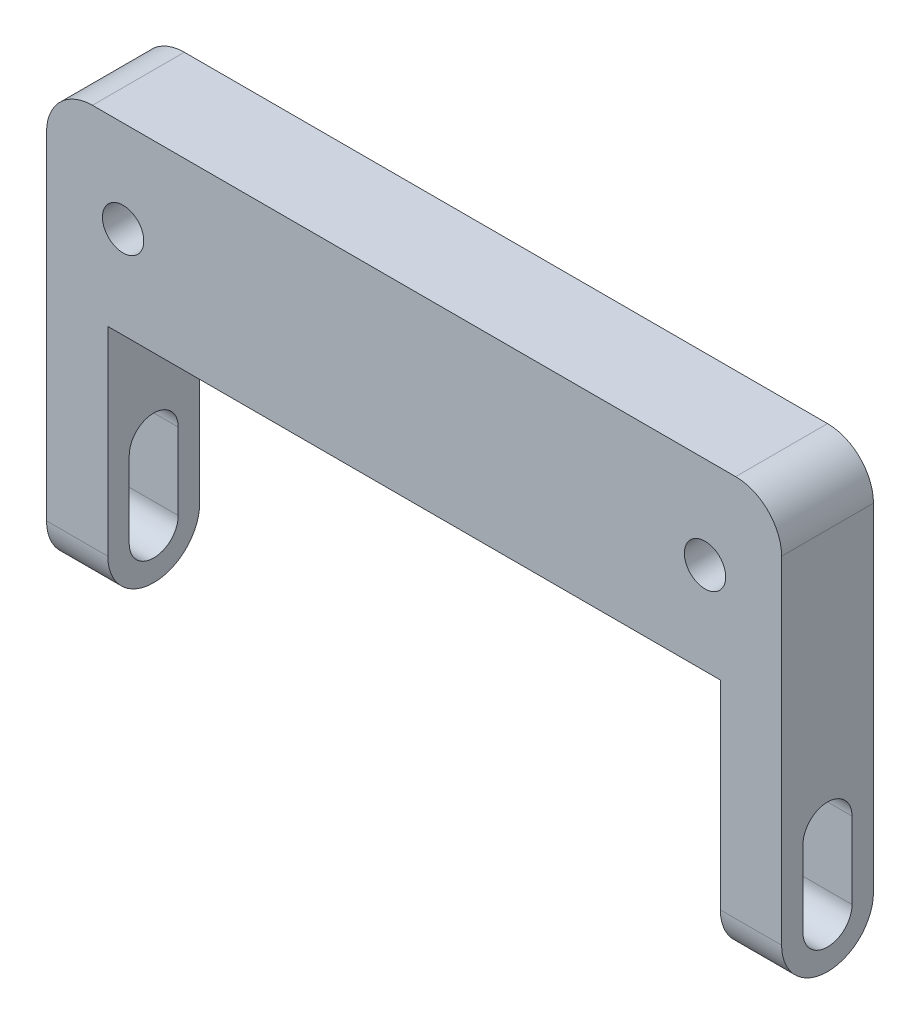
ISO-10303-21;
HEADER;
FILE_DESCRIPTION(('STEP AP214'),'2;1');
FILE_NAME('part.step','',(''),(''),'','','');
FILE_SCHEMA(('AUTOMOTIVE_DESIGN { 1 0 10303 214 1 1 1 1 }'));
ENDSEC;
DATA;
#1=APPLICATION_CONTEXT('core data for automotive mechanical design processes');
#2=APPLICATION_PROTOCOL_DEFINITION('international standard','automotive_design',2000,#1);
#3=PRODUCT_CONTEXT('',#1,'mechanical');
#4=PRODUCT('Part','Part','',(#3));
#5=PRODUCT_RELATED_PRODUCT_CATEGORY('part','',(#4));
#6=PRODUCT_DEFINITION_FORMATION('','',#4);
#7=PRODUCT_DEFINITION_CONTEXT('part definition',#1,'design');
#8=PRODUCT_DEFINITION('design','',#6,#7);
#9=PRODUCT_DEFINITION_SHAPE('','',#8);
#10=(LENGTH_UNIT() NAMED_UNIT(*) SI_UNIT(.MILLI.,.METRE.));
#11=(NAMED_UNIT(*) PLANE_ANGLE_UNIT() SI_UNIT($,.RADIAN.));
#12=(NAMED_UNIT(*) SI_UNIT($,.STERADIAN.) SOLID_ANGLE_UNIT());
#13=UNCERTAINTY_MEASURE_WITH_UNIT(LENGTH_MEASURE(1.E-05),#10,'distance_accuracy_value','');
#14=(GEOMETRIC_REPRESENTATION_CONTEXT(3) GLOBAL_UNCERTAINTY_ASSIGNED_CONTEXT((#13)) GLOBAL_UNIT_ASSIGNED_CONTEXT((#10,
#11,#12)) REPRESENTATION_CONTEXT('',''));
#15=CARTESIAN_POINT('',(0.,0.,0.));
#16=DIRECTION('',(0.,0.,1.));
#17=DIRECTION('',(1.,0.,0.));
#18=AXIS2_PLACEMENT_3D('',#15,#16,#17);
#19=CARTESIAN_POINT('',(-24.,-6.,6.));
#20=DIRECTION('',(1.,0.,0.));
#21=DIRECTION('',(0.,1.,0.));
#22=AXIS2_PLACEMENT_3D('',#19,#20,#21);
#23=PLANE('',#22);
#24=DIRECTION('',(0.,-1.,0.));
#25=VECTOR('',#24,1.);
#26=CARTESIAN_POINT('',(-24.,-6.,6.));
#27=LINE('',#26,#25);
#28=CARTESIAN_POINT('',(-24.,3.,6.));
#29=VERTEX_POINT('',#28);
#30=CARTESIAN_POINT('',(-24.,-19.,6.));
#31=VERTEX_POINT('',#30);
#32=EDGE_CURVE('E251',#29,#31,#27,.T.);
#33=ORIENTED_EDGE('',*,*,#32,.F.);
#34=DIRECTION('',(0.,0.,-1.));
#35=VECTOR('',#34,1.);
#36=CARTESIAN_POINT('',(-24.,3.,6.));
#37=LINE('',#36,#35);
#38=CARTESIAN_POINT('',(-24.,3.,0.));
#39=VERTEX_POINT('',#38);
#40=EDGE_CURVE('E284',#29,#39,#37,.T.);
#41=ORIENTED_EDGE('',*,*,#40,.T.);
#42=DIRECTION('',(0.,-1.,0.));
#43=VECTOR('',#42,1.);
#44=CARTESIAN_POINT('',(-24.,-6.,0.));
#45=LINE('',#44,#43);
#46=CARTESIAN_POINT('',(-24.,-19.,0.));
#47=VERTEX_POINT('',#46);
#48=EDGE_CURVE('E264',#39,#47,#45,.T.);
#49=ORIENTED_EDGE('',*,*,#48,.T.);
#50=CARTESIAN_POINT('',(-24.,-19.,3.));
#51=DIRECTION('',(1.,0.,0.));
#52=DIRECTION('',(0.,1.,0.));
#53=AXIS2_PLACEMENT_3D('',#50,#51,#52);
#54=CIRCLE('',#53,3.);
#55=CARTESIAN_POINT('',(-24.,-22.,3.));
#56=VERTEX_POINT('',#55);
#57=EDGE_CURVE('E280',#47,#56,#54,.F.);
#58=ORIENTED_EDGE('',*,*,#57,.T.);
#59=CARTESIAN_POINT('',(-24.,-19.,3.));
#60=DIRECTION('',(1.,0.,0.));
#61=DIRECTION('',(0.,1.,0.));
#62=AXIS2_PLACEMENT_3D('',#59,#60,#61);
#63=CIRCLE('',#62,3.);
#64=EDGE_CURVE('E282',#56,#31,#63,.F.);
#65=ORIENTED_EDGE('',*,*,#64,.T.);
#66=EDGE_LOOP('',(#33,#41,#49,#58,#65));
#67=FACE_BOUND('',#66,.T.);
#68=CARTESIAN_POINT('',(-24.,-14.,3.));
#69=DIRECTION('',(1.,0.,0.));
#70=DIRECTION('',(0.,1.,0.));
#71=AXIS2_PLACEMENT_3D('',#68,#69,#70);
#72=CIRCLE('',#71,1.6);
#73=CARTESIAN_POINT('',(-24.,-14.,1.4));
#74=VERTEX_POINT('',#73);
#75=CARTESIAN_POINT('',(-24.,-14.,4.6));
#76=VERTEX_POINT('',#75);
#77=EDGE_CURVE('E190',#74,#76,#72,.T.);
#78=ORIENTED_EDGE('',*,*,#77,.T.);
#79=DIRECTION('',(0.,-1.,0.));
#80=VECTOR('',#79,1.);
#81=CARTESIAN_POINT('',(-24.,-14.,4.6));
#82=LINE('',#81,#80);
#83=CARTESIAN_POINT('',(-24.,-19.,4.6));
#84=VERTEX_POINT('',#83);
#85=EDGE_CURVE('E191',#76,#84,#82,.T.);
#86=ORIENTED_EDGE('',*,*,#85,.T.);
#87=CARTESIAN_POINT('',(-24.,-19.,3.));
#88=DIRECTION('',(1.,0.,0.));
#89=DIRECTION('',(0.,1.,0.));
#90=AXIS2_PLACEMENT_3D('',#87,#88,#89);
#91=CIRCLE('',#90,1.6);
#92=CARTESIAN_POINT('',(-24.,-19.,1.4));
#93=VERTEX_POINT('',#92);
#94=EDGE_CURVE('E204',#84,#93,#91,.T.);
#95=ORIENTED_EDGE('',*,*,#94,.T.);
#96=DIRECTION('',(0.,1.,0.));
#97=VECTOR('',#96,1.);
#98=CARTESIAN_POINT('',(-24.,-14.,1.4));
#99=LINE('',#98,#97);
#100=EDGE_CURVE('E197',#93,#74,#99,.T.);
#101=ORIENTED_EDGE('',*,*,#100,.T.);
#102=EDGE_LOOP('',(#78,#86,#95,#101));
#103=FACE_BOUND('',#102,.T.);
#104=ADVANCED_FACE('F34',(#67,#103),#23,.F.);
#105=CARTESIAN_POINT('',(-20.,-6.,6.));
#106=DIRECTION('',(-1.,0.,0.));
#107=DIRECTION('',(0.,-1.,0.));
#108=AXIS2_PLACEMENT_3D('',#105,#106,#107);
#109=PLANE('',#108);
#110=DIRECTION('',(0.,1.,0.));
#111=VECTOR('',#110,1.);
#112=CARTESIAN_POINT('',(-20.,-6.,6.));
#113=LINE('',#112,#111);
#114=CARTESIAN_POINT('',(-20.,-19.,6.));
#115=VERTEX_POINT('',#114);
#116=CARTESIAN_POINT('',(-20.,-6.,6.));
#117=VERTEX_POINT('',#116);
#118=EDGE_CURVE('E254',#115,#117,#113,.T.);
#119=ORIENTED_EDGE('',*,*,#118,.F.);
#120=CARTESIAN_POINT('',(-20.,-19.,3.));
#121=DIRECTION('',(-1.,0.,0.));
#122=DIRECTION('',(0.,-1.,0.));
#123=AXIS2_PLACEMENT_3D('',#120,#121,#122);
#124=CIRCLE('',#123,3.);
#125=CARTESIAN_POINT('',(-20.,-22.,3.));
#126=VERTEX_POINT('',#125);
#127=EDGE_CURVE('E57',#115,#126,#124,.F.);
#128=ORIENTED_EDGE('',*,*,#127,.T.);
#129=CARTESIAN_POINT('',(-20.,-19.,3.));
#130=DIRECTION('',(-1.,0.,0.));
#131=DIRECTION('',(0.,-1.,0.));
#132=AXIS2_PLACEMENT_3D('',#129,#130,#131);
#133=CIRCLE('',#132,3.);
#134=CARTESIAN_POINT('',(-20.,-19.,0.));
#135=VERTEX_POINT('',#134);
#136=EDGE_CURVE('E316',#126,#135,#133,.F.);
#137=ORIENTED_EDGE('',*,*,#136,.T.);
#138=DIRECTION('',(0.,1.,0.));
#139=VECTOR('',#138,1.);
#140=CARTESIAN_POINT('',(-20.,-6.,0.));
#141=LINE('',#140,#139);
#142=CARTESIAN_POINT('',(-20.,-6.,0.));
#143=VERTEX_POINT('',#142);
#144=EDGE_CURVE('E267',#135,#143,#141,.T.);
#145=ORIENTED_EDGE('',*,*,#144,.T.);
#146=DIRECTION('',(0.,0.,-1.));
#147=VECTOR('',#146,1.);
#148=CARTESIAN_POINT('',(-20.,-6.,6.));
#149=LINE('',#148,#147);
#150=EDGE_CURVE('E277',#117,#143,#149,.T.);
#151=ORIENTED_EDGE('',*,*,#150,.F.);
#152=EDGE_LOOP('',(#119,#128,#137,#145,#151));
#153=FACE_BOUND('',#152,.T.);
#154=CARTESIAN_POINT('',(-20.,-14.,3.));
#155=DIRECTION('',(-1.,0.,0.));
#156=DIRECTION('',(0.,-1.,0.));
#157=AXIS2_PLACEMENT_3D('',#154,#155,#156);
#158=CIRCLE('',#157,1.6);
#159=CARTESIAN_POINT('',(-20.,-14.,4.6));
#160=VERTEX_POINT('',#159);
#161=CARTESIAN_POINT('',(-20.,-14.,1.4));
#162=VERTEX_POINT('',#161);
#163=EDGE_CURVE('E187',#160,#162,#158,.T.);
#164=ORIENTED_EDGE('',*,*,#163,.T.);
#165=DIRECTION('',(0.,-1.,0.));
#166=VECTOR('',#165,1.);
#167=CARTESIAN_POINT('',(-20.,-14.,1.4));
#168=LINE('',#167,#166);
#169=CARTESIAN_POINT('',(-20.,-19.,1.4));
#170=VERTEX_POINT('',#169);
#171=EDGE_CURVE('E171',#162,#170,#168,.T.);
#172=ORIENTED_EDGE('',*,*,#171,.T.);
#173=CARTESIAN_POINT('',(-20.,-19.,3.));
#174=DIRECTION('',(-1.,0.,0.));
#175=DIRECTION('',(0.,-1.,0.));
#176=AXIS2_PLACEMENT_3D('',#173,#174,#175);
#177=CIRCLE('',#176,1.6);
#178=CARTESIAN_POINT('',(-20.,-19.,4.6));
#179=VERTEX_POINT('',#178);
#180=EDGE_CURVE('E199',#170,#179,#177,.T.);
#181=ORIENTED_EDGE('',*,*,#180,.T.);
#182=DIRECTION('',(0.,1.,0.));
#183=VECTOR('',#182,1.);
#184=CARTESIAN_POINT('',(-20.,-14.,4.6));
#185=LINE('',#184,#183);
#186=EDGE_CURVE('E195',#179,#160,#185,.T.);
#187=ORIENTED_EDGE('',*,*,#186,.T.);
#188=EDGE_LOOP('',(#164,#172,#181,#187));
#189=FACE_BOUND('',#188,.T.);
#190=ADVANCED_FACE('F194',(#153,#189),#109,.F.);
#191=CARTESIAN_POINT('',(-24.,6.,6.));
#192=DIRECTION('',(0.,-1.,0.));
#193=DIRECTION('',(0.,0.,-1.));
#194=AXIS2_PLACEMENT_3D('',#191,#192,#193);
#195=PLANE('',#194);
#196=DIRECTION('',(-1.,0.,0.));
#197=VECTOR('',#196,1.);
#198=CARTESIAN_POINT('',(-24.,6.,0.));
#199=LINE('',#198,#197);
#200=CARTESIAN_POINT('',(21.,6.,0.));
#201=VERTEX_POINT('',#200);
#202=CARTESIAN_POINT('',(-21.,6.,0.));
#203=VERTEX_POINT('',#202);
#204=EDGE_CURVE('E243',#201,#203,#199,.T.);
#205=ORIENTED_EDGE('',*,*,#204,.T.);
#206=DIRECTION('',(0.,0.,-1.));
#207=VECTOR('',#206,1.);
#208=CARTESIAN_POINT('',(-21.,6.,6.));
#209=LINE('',#208,#207);
#210=CARTESIAN_POINT('',(-21.,6.,6.));
#211=VERTEX_POINT('',#210);
#212=EDGE_CURVE('E299',#203,#211,#209,.F.);
#213=ORIENTED_EDGE('',*,*,#212,.T.);
#214=DIRECTION('',(-1.,0.,0.));
#215=VECTOR('',#214,1.);
#216=CARTESIAN_POINT('',(-24.,6.,6.));
#217=LINE('',#216,#215);
#218=CARTESIAN_POINT('',(21.,6.,6.));
#219=VERTEX_POINT('',#218);
#220=EDGE_CURVE('E247',#219,#211,#217,.T.);
#221=ORIENTED_EDGE('',*,*,#220,.F.);
#222=DIRECTION('',(0.,0.,-1.));
#223=VECTOR('',#222,1.);
#224=CARTESIAN_POINT('',(21.,6.,6.));
#225=LINE('',#224,#223);
#226=EDGE_CURVE('E296',#219,#201,#225,.T.);
#227=ORIENTED_EDGE('',*,*,#226,.T.);
#228=EDGE_LOOP('',(#205,#213,#221,#227));
#229=FACE_BOUND('',#228,.T.);
#230=ADVANCED_FACE('F380',(#229),#195,.F.);
#231=CARTESIAN_POINT('',(-20.,-6.,6.));
#232=DIRECTION('',(0.,1.,0.));
#233=DIRECTION('',(0.,0.,1.));
#234=AXIS2_PLACEMENT_3D('',#231,#232,#233);
#235=PLANE('',#234);
#236=DIRECTION('',(1.,0.,0.));
#237=VECTOR('',#236,1.);
#238=CARTESIAN_POINT('',(-20.,-6.,0.));
#239=LINE('',#238,#237);
#240=CARTESIAN_POINT('',(20.,-6.,0.));
#241=VERTEX_POINT('',#240);
#242=EDGE_CURVE('E269',#143,#241,#239,.T.);
#243=ORIENTED_EDGE('',*,*,#242,.T.);
#244=DIRECTION('',(0.,0.,-1.));
#245=VECTOR('',#244,1.);
#246=CARTESIAN_POINT('',(20.,-6.,6.));
#247=LINE('',#246,#245);
#248=CARTESIAN_POINT('',(20.,-6.,6.));
#249=VERTEX_POINT('',#248);
#250=EDGE_CURVE('E261',#249,#241,#247,.T.);
#251=ORIENTED_EDGE('',*,*,#250,.F.);
#252=DIRECTION('',(1.,0.,0.));
#253=VECTOR('',#252,1.);
#254=CARTESIAN_POINT('',(-20.,-6.,6.));
#255=LINE('',#254,#253);
#256=EDGE_CURVE('E256',#117,#249,#255,.T.);
#257=ORIENTED_EDGE('',*,*,#256,.F.);
#258=ORIENTED_EDGE('',*,*,#150,.T.);
#259=EDGE_LOOP('',(#243,#251,#257,#258));
#260=FACE_BOUND('',#259,.T.);
#261=ADVANCED_FACE('F402',(#260),#235,.F.);
#262=CARTESIAN_POINT('',(20.,-6.,6.));
#263=DIRECTION('',(1.,0.,0.));
#264=DIRECTION('',(0.,1.,0.));
#265=AXIS2_PLACEMENT_3D('',#262,#263,#264);
#266=PLANE('',#265);
#267=CARTESIAN_POINT('',(20.,-14.,3.));
#268=DIRECTION('',(1.,0.,0.));
#269=DIRECTION('',(0.,1.,0.));
#270=AXIS2_PLACEMENT_3D('',#267,#268,#269);
#271=CIRCLE('',#270,1.6);
#272=CARTESIAN_POINT('',(20.,-14.,4.6));
#273=VERTEX_POINT('',#272);
#274=CARTESIAN_POINT('',(20.,-14.,1.4));
#275=VERTEX_POINT('',#274);
#276=EDGE_CURVE('E214',#273,#275,#271,.F.);
#277=ORIENTED_EDGE('',*,*,#276,.F.);
#278=DIRECTION('',(0.,1.,0.));
#279=VECTOR('',#278,1.);
#280=CARTESIAN_POINT('',(20.,-14.,4.6));
#281=LINE('',#280,#279);
#282=CARTESIAN_POINT('',(20.,-19.,4.6));
#283=VERTEX_POINT('',#282);
#284=EDGE_CURVE('E182',#283,#273,#281,.T.);
#285=ORIENTED_EDGE('',*,*,#284,.F.);
#286=CARTESIAN_POINT('',(20.,-19.,3.));
#287=DIRECTION('',(1.,0.,0.));
#288=DIRECTION('',(0.,1.,0.));
#289=AXIS2_PLACEMENT_3D('',#286,#287,#288);
#290=CIRCLE('',#289,1.6);
#291=CARTESIAN_POINT('',(20.,-19.,1.4));
#292=VERTEX_POINT('',#291);
#293=EDGE_CURVE('E227',#292,#283,#290,.F.);
#294=ORIENTED_EDGE('',*,*,#293,.F.);
#295=DIRECTION('',(0.,-1.,0.));
#296=VECTOR('',#295,1.);
#297=CARTESIAN_POINT('',(20.,-14.,1.4));
#298=LINE('',#297,#296);
#299=EDGE_CURVE('E230',#275,#292,#298,.T.);
#300=ORIENTED_EDGE('',*,*,#299,.F.);
#301=EDGE_LOOP('',(#277,#285,#294,#300));
#302=FACE_BOUND('',#301,.T.);
#303=DIRECTION('',(0.,-1.,0.));
#304=VECTOR('',#303,1.);
#305=CARTESIAN_POINT('',(20.,-6.,0.));
#306=LINE('',#305,#304);
#307=CARTESIAN_POINT('',(20.,-19.,0.));
#308=VERTEX_POINT('',#307);
#309=EDGE_CURVE('E271',#241,#308,#306,.T.);
#310=ORIENTED_EDGE('',*,*,#309,.T.);
#311=CARTESIAN_POINT('',(20.,-19.,3.));
#312=DIRECTION('',(1.,0.,0.));
#313=DIRECTION('',(0.,1.,0.));
#314=AXIS2_PLACEMENT_3D('',#311,#312,#313);
#315=CIRCLE('',#314,3.);
#316=CARTESIAN_POINT('',(20.,-22.,3.));
#317=VERTEX_POINT('',#316);
#318=EDGE_CURVE('E11',#308,#317,#315,.F.);
#319=ORIENTED_EDGE('',*,*,#318,.T.);
#320=CARTESIAN_POINT('',(20.,-19.,3.));
#321=DIRECTION('',(1.,0.,0.));
#322=DIRECTION('',(0.,1.,0.));
#323=AXIS2_PLACEMENT_3D('',#320,#321,#322);
#324=CIRCLE('',#323,3.);
#325=CARTESIAN_POINT('',(20.,-19.,6.));
#326=VERTEX_POINT('',#325);
#327=EDGE_CURVE('E43',#317,#326,#324,.F.);
#328=ORIENTED_EDGE('',*,*,#327,.T.);
#329=DIRECTION('',(0.,-1.,0.));
#330=VECTOR('',#329,1.);
#331=CARTESIAN_POINT('',(20.,-6.,6.));
#332=LINE('',#331,#330);
#333=EDGE_CURVE('E258',#249,#326,#332,.T.);
#334=ORIENTED_EDGE('',*,*,#333,.F.);
#335=ORIENTED_EDGE('',*,*,#250,.T.);
#336=EDGE_LOOP('',(#310,#319,#328,#334,#335));
#337=FACE_BOUND('',#336,.T.);
#338=ADVANCED_FACE('F397',(#302,#337),#266,.F.);
#339=CARTESIAN_POINT('',(24.,-6.,6.));
#340=DIRECTION('',(-1.,0.,0.));
#341=DIRECTION('',(0.,-1.,0.));
#342=AXIS2_PLACEMENT_3D('',#339,#340,#341);
#343=PLANE('',#342);
#344=CARTESIAN_POINT('',(24.,-19.,3.));
#345=DIRECTION('',(1.,0.,0.));
#346=DIRECTION('',(0.,1.,0.));
#347=AXIS2_PLACEMENT_3D('',#344,#345,#346);
#348=CIRCLE('',#347,1.6);
#349=CARTESIAN_POINT('',(24.,-19.,4.6));
#350=VERTEX_POINT('',#349);
#351=CARTESIAN_POINT('',(24.,-19.,1.4));
#352=VERTEX_POINT('',#351);
#353=EDGE_CURVE('E218',#350,#352,#348,.T.);
#354=ORIENTED_EDGE('',*,*,#353,.F.);
#355=DIRECTION('',(0.,-1.,0.));
#356=VECTOR('',#355,1.);
#357=CARTESIAN_POINT('',(24.,-14.,4.6));
#358=LINE('',#357,#356);
#359=CARTESIAN_POINT('',(24.,-14.,4.6));
#360=VERTEX_POINT('',#359);
#361=EDGE_CURVE('E221',#360,#350,#358,.T.);
#362=ORIENTED_EDGE('',*,*,#361,.F.);
#363=CARTESIAN_POINT('',(24.,-14.,3.));
#364=DIRECTION('',(1.,0.,0.));
#365=DIRECTION('',(0.,1.,0.));
#366=AXIS2_PLACEMENT_3D('',#363,#364,#365);
#367=CIRCLE('',#366,1.6);
#368=CARTESIAN_POINT('',(24.,-14.,1.4));
#369=VERTEX_POINT('',#368);
#370=EDGE_CURVE('E224',#369,#360,#367,.T.);
#371=ORIENTED_EDGE('',*,*,#370,.F.);
#372=DIRECTION('',(0.,1.,0.));
#373=VECTOR('',#372,1.);
#374=CARTESIAN_POINT('',(24.,-14.,1.4));
#375=LINE('',#374,#373);
#376=EDGE_CURVE('E215',#352,#369,#375,.T.);
#377=ORIENTED_EDGE('',*,*,#376,.F.);
#378=EDGE_LOOP('',(#354,#362,#371,#377));
#379=FACE_BOUND('',#378,.T.);
#380=DIRECTION('',(0.,1.,0.));
#381=VECTOR('',#380,1.);
#382=CARTESIAN_POINT('',(24.,-6.,0.));
#383=LINE('',#382,#381);
#384=CARTESIAN_POINT('',(24.,-19.,0.));
#385=VERTEX_POINT('',#384);
#386=CARTESIAN_POINT('',(24.,3.,0.));
#387=VERTEX_POINT('',#386);
#388=EDGE_CURVE('E248',#385,#387,#383,.T.);
#389=ORIENTED_EDGE('',*,*,#388,.T.);
#390=DIRECTION('',(0.,0.,-1.));
#391=VECTOR('',#390,1.);
#392=CARTESIAN_POINT('',(24.,3.,6.));
#393=LINE('',#392,#391);
#394=CARTESIAN_POINT('',(24.,3.,6.));
#395=VERTEX_POINT('',#394);
#396=EDGE_CURVE('E314',#387,#395,#393,.F.);
#397=ORIENTED_EDGE('',*,*,#396,.T.);
#398=DIRECTION('',(0.,1.,0.));
#399=VECTOR('',#398,1.);
#400=CARTESIAN_POINT('',(24.,-6.,6.));
#401=LINE('',#400,#399);
#402=CARTESIAN_POINT('',(24.,-19.,6.));
#403=VERTEX_POINT('',#402);
#404=EDGE_CURVE('E244',#403,#395,#401,.T.);
#405=ORIENTED_EDGE('',*,*,#404,.F.);
#406=CARTESIAN_POINT('',(24.,-19.,3.));
#407=DIRECTION('',(-1.,0.,0.));
#408=DIRECTION('',(0.,-1.,0.));
#409=AXIS2_PLACEMENT_3D('',#406,#407,#408);
#410=CIRCLE('',#409,3.);
#411=CARTESIAN_POINT('',(24.,-22.,3.));
#412=VERTEX_POINT('',#411);
#413=EDGE_CURVE('E310',#403,#412,#410,.F.);
#414=ORIENTED_EDGE('',*,*,#413,.T.);
#415=CARTESIAN_POINT('',(24.,-19.,3.));
#416=DIRECTION('',(-1.,0.,0.));
#417=DIRECTION('',(0.,-1.,0.));
#418=AXIS2_PLACEMENT_3D('',#415,#416,#417);
#419=CIRCLE('',#418,3.);
#420=EDGE_CURVE('E312',#412,#385,#419,.F.);
#421=ORIENTED_EDGE('',*,*,#420,.T.);
#422=EDGE_LOOP('',(#389,#397,#405,#414,#421));
#423=FACE_BOUND('',#422,.T.);
#424=ADVANCED_FACE('F387',(#379,#423),#343,.F.);
#425=CARTESIAN_POINT('',(0.,0.,6.));
#426=DIRECTION('',(0.,0.,-1.));
#427=DIRECTION('',(-1.,0.,0.));
#428=AXIS2_PLACEMENT_3D('',#425,#426,#427);
#429=PLANE('',#428);
#430=CARTESIAN_POINT('',(19.,0.,6.));
#431=DIRECTION('',(0.,0.,-1.));
#432=DIRECTION('',(-1.,0.,0.));
#433=AXIS2_PLACEMENT_3D('',#430,#431,#432);
#434=CIRCLE('',#433,1.35);
#435=CARTESIAN_POINT('',(17.65,0.,6.));
#436=VERTEX_POINT('',#435);
#437=EDGE_CURVE('E335',#436,#436,#434,.T.);
#438=ORIENTED_EDGE('',*,*,#437,.T.);
#439=EDGE_LOOP('',(#438));
#440=FACE_BOUND('',#439,.T.);
#441=CARTESIAN_POINT('',(-19.,0.,6.));
#442=DIRECTION('',(0.,0.,-1.));
#443=DIRECTION('',(-1.,0.,0.));
#444=AXIS2_PLACEMENT_3D('',#441,#442,#443);
#445=CIRCLE('',#444,1.35);
#446=CARTESIAN_POINT('',(-20.35,0.,6.));
#447=VERTEX_POINT('',#446);
#448=EDGE_CURVE('E325',#447,#447,#445,.T.);
#449=ORIENTED_EDGE('',*,*,#448,.T.);
#450=EDGE_LOOP('',(#449));
#451=FACE_BOUND('',#450,.T.);
#452=ORIENTED_EDGE('',*,*,#220,.T.);
#453=CARTESIAN_POINT('',(-21.,3.,6.));
#454=DIRECTION('',(0.,0.,-1.));
#455=DIRECTION('',(-1.,0.,0.));
#456=AXIS2_PLACEMENT_3D('',#453,#454,#455);
#457=CIRCLE('',#456,3.);
#458=EDGE_CURVE('E308',#211,#29,#457,.F.);
#459=ORIENTED_EDGE('',*,*,#458,.T.);
#460=ORIENTED_EDGE('',*,*,#32,.T.);
#461=DIRECTION('',(1.,0.,0.));
#462=VECTOR('',#461,1.);
#463=CARTESIAN_POINT('',(0.,-19.,6.));
#464=LINE('',#463,#462);
#465=EDGE_CURVE('E303',#31,#115,#464,.T.);
#466=ORIENTED_EDGE('',*,*,#465,.T.);
#467=ORIENTED_EDGE('',*,*,#118,.T.);
#468=ORIENTED_EDGE('',*,*,#256,.T.);
#469=ORIENTED_EDGE('',*,*,#333,.T.);
#470=DIRECTION('',(1.,0.,0.));
#471=VECTOR('',#470,1.);
#472=CARTESIAN_POINT('',(0.,-19.,6.));
#473=LINE('',#472,#471);
#474=EDGE_CURVE('E301',#326,#403,#473,.T.);
#475=ORIENTED_EDGE('',*,*,#474,.T.);
#476=ORIENTED_EDGE('',*,*,#404,.T.);
#477=CARTESIAN_POINT('',(21.,3.,6.));
#478=DIRECTION('',(0.,0.,-1.));
#479=DIRECTION('',(-1.,0.,0.));
#480=AXIS2_PLACEMENT_3D('',#477,#478,#479);
#481=CIRCLE('',#480,3.);
#482=EDGE_CURVE('E306',#395,#219,#481,.F.);
#483=ORIENTED_EDGE('',*,*,#482,.T.);
#484=EDGE_LOOP('',(#452,#459,#460,#466,#467,#468,#469,#475,#476,#483));
#485=FACE_BOUND('',#484,.T.);
#486=ADVANCED_FACE('F344',(#440,#451,#485),#429,.F.);
#487=CARTESIAN_POINT('',(0.,0.,0.));
#488=DIRECTION('',(0.,0.,-1.));
#489=DIRECTION('',(-1.,0.,0.));
#490=AXIS2_PLACEMENT_3D('',#487,#488,#489);
#491=PLANE('',#490);
#492=CARTESIAN_POINT('',(19.,0.,0.));
#493=DIRECTION('',(0.,0.,-1.));
#494=DIRECTION('',(-1.,0.,0.));
#495=AXIS2_PLACEMENT_3D('',#492,#493,#494);
#496=CIRCLE('',#495,1.35);
#497=CARTESIAN_POINT('',(17.65,0.,0.));
#498=VERTEX_POINT('',#497);
#499=EDGE_CURVE('E338',#498,#498,#496,.T.);
#500=ORIENTED_EDGE('',*,*,#499,.F.);
#501=EDGE_LOOP('',(#500));
#502=FACE_BOUND('',#501,.T.);
#503=CARTESIAN_POINT('',(-19.,0.,0.));
#504=DIRECTION('',(0.,0.,-1.));
#505=DIRECTION('',(-1.,0.,0.));
#506=AXIS2_PLACEMENT_3D('',#503,#504,#505);
#507=CIRCLE('',#506,1.35);
#508=CARTESIAN_POINT('',(-20.35,0.,0.));
#509=VERTEX_POINT('',#508);
#510=EDGE_CURVE('E330',#509,#509,#507,.T.);
#511=ORIENTED_EDGE('',*,*,#510,.F.);
#512=EDGE_LOOP('',(#511));
#513=FACE_BOUND('',#512,.T.);
#514=ORIENTED_EDGE('',*,*,#48,.F.);
#515=CARTESIAN_POINT('',(-21.,3.,0.));
#516=DIRECTION('',(0.,0.,-1.));
#517=DIRECTION('',(-1.,0.,0.));
#518=AXIS2_PLACEMENT_3D('',#515,#516,#517);
#519=CIRCLE('',#518,3.);
#520=EDGE_CURVE('E294',#39,#203,#519,.T.);
#521=ORIENTED_EDGE('',*,*,#520,.T.);
#522=ORIENTED_EDGE('',*,*,#204,.F.);
#523=CARTESIAN_POINT('',(21.,3.,0.));
#524=DIRECTION('',(0.,0.,-1.));
#525=DIRECTION('',(-1.,0.,0.));
#526=AXIS2_PLACEMENT_3D('',#523,#524,#525);
#527=CIRCLE('',#526,3.);
#528=EDGE_CURVE('E292',#201,#387,#527,.T.);
#529=ORIENTED_EDGE('',*,*,#528,.T.);
#530=ORIENTED_EDGE('',*,*,#388,.F.);
#531=DIRECTION('',(1.,0.,0.));
#532=VECTOR('',#531,1.);
#533=CARTESIAN_POINT('',(20.,-19.,0.));
#534=LINE('',#533,#532);
#535=EDGE_CURVE('E287',#385,#308,#534,.F.);
#536=ORIENTED_EDGE('',*,*,#535,.T.);
#537=ORIENTED_EDGE('',*,*,#309,.F.);
#538=ORIENTED_EDGE('',*,*,#242,.F.);
#539=ORIENTED_EDGE('',*,*,#144,.F.);
#540=DIRECTION('',(1.,0.,0.));
#541=VECTOR('',#540,1.);
#542=CARTESIAN_POINT('',(-24.,-19.,0.));
#543=LINE('',#542,#541);
#544=EDGE_CURVE('E290',#135,#47,#543,.F.);
#545=ORIENTED_EDGE('',*,*,#544,.T.);
#546=EDGE_LOOP('',(#514,#521,#522,#529,#530,#536,#537,#538,#539,#545));
#547=FACE_BOUND('',#546,.T.);
#548=ADVANCED_FACE('F353',(#502,#513,#547),#491,.T.);
#549=CARTESIAN_POINT('',(-24.001,-14.,4.6));
#550=DIRECTION('',(0.,0.,1.));
#551=DIRECTION('',(1.,0.,0.));
#552=AXIS2_PLACEMENT_3D('',#549,#550,#551);
#553=PLANE('',#552);
#554=ORIENTED_EDGE('',*,*,#284,.T.);
#555=DIRECTION('',(1.,0.,0.));
#556=VECTOR('',#555,1.);
#557=CARTESIAN_POINT('',(-24.001,-14.,4.6));
#558=LINE('',#557,#556);
#559=EDGE_CURVE('E238',#273,#360,#558,.T.);
#560=ORIENTED_EDGE('',*,*,#559,.T.);
#561=ORIENTED_EDGE('',*,*,#361,.T.);
#562=DIRECTION('',(1.,0.,0.));
#563=VECTOR('',#562,1.);
#564=CARTESIAN_POINT('',(-24.001,-19.,4.6));
#565=LINE('',#564,#563);
#566=EDGE_CURVE('E217',#283,#350,#565,.T.);
#567=ORIENTED_EDGE('',*,*,#566,.F.);
#568=EDGE_LOOP('',(#554,#560,#561,#567));
#569=FACE_BOUND('',#568,.T.);
#570=ADVANCED_FACE('F356',(#569),#553,.F.);
#571=CARTESIAN_POINT('',(-24.001,-19.,3.));
#572=DIRECTION('',(1.,0.,0.));
#573=DIRECTION('',(0.,1.,0.));
#574=AXIS2_PLACEMENT_3D('',#571,#572,#573);
#575=CYLINDRICAL_SURFACE('',#574,1.6);
#576=ORIENTED_EDGE('',*,*,#293,.T.);
#577=ORIENTED_EDGE('',*,*,#566,.T.);
#578=ORIENTED_EDGE('',*,*,#353,.T.);
#579=DIRECTION('',(1.,0.,0.));
#580=VECTOR('',#579,1.);
#581=CARTESIAN_POINT('',(-24.001,-19.,1.4));
#582=LINE('',#581,#580);
#583=EDGE_CURVE('E239',#292,#352,#582,.T.);
#584=ORIENTED_EDGE('',*,*,#583,.F.);
#585=EDGE_LOOP('',(#576,#577,#578,#584));
#586=FACE_BOUND('',#585,.T.);
#587=ADVANCED_FACE('F492',(#586),#575,.F.);
#588=CARTESIAN_POINT('',(-24.001,-14.,1.4));
#589=DIRECTION('',(0.,0.,-1.));
#590=DIRECTION('',(-1.,0.,0.));
#591=AXIS2_PLACEMENT_3D('',#588,#589,#590);
#592=PLANE('',#591);
#593=ORIENTED_EDGE('',*,*,#299,.T.);
#594=ORIENTED_EDGE('',*,*,#583,.T.);
#595=ORIENTED_EDGE('',*,*,#376,.T.);
#596=DIRECTION('',(1.,0.,0.));
#597=VECTOR('',#596,1.);
#598=CARTESIAN_POINT('',(-24.001,-14.,1.4));
#599=LINE('',#598,#597);
#600=EDGE_CURVE('E235',#275,#369,#599,.T.);
#601=ORIENTED_EDGE('',*,*,#600,.F.);
#602=EDGE_LOOP('',(#593,#594,#595,#601));
#603=FACE_BOUND('',#602,.T.);
#604=ADVANCED_FACE('F484',(#603),#592,.F.);
#605=CARTESIAN_POINT('',(-24.001,-14.,3.));
#606=DIRECTION('',(1.,0.,0.));
#607=DIRECTION('',(0.,1.,0.));
#608=AXIS2_PLACEMENT_3D('',#605,#606,#607);
#609=CYLINDRICAL_SURFACE('',#608,1.6);
#610=ORIENTED_EDGE('',*,*,#276,.T.);
#611=ORIENTED_EDGE('',*,*,#600,.T.);
#612=ORIENTED_EDGE('',*,*,#370,.T.);
#613=ORIENTED_EDGE('',*,*,#559,.F.);
#614=EDGE_LOOP('',(#610,#611,#612,#613));
#615=FACE_BOUND('',#614,.T.);
#616=ADVANCED_FACE('F477',(#615),#609,.F.);
#617=CARTESIAN_POINT('',(24.001,-14.,3.));
#618=DIRECTION('',(-1.,0.,0.));
#619=DIRECTION('',(0.,-1.,0.));
#620=AXIS2_PLACEMENT_3D('',#617,#618,#619);
#621=CYLINDRICAL_SURFACE('',#620,1.6);
#622=DIRECTION('',(-1.,0.,0.));
#623=VECTOR('',#622,1.);
#624=CARTESIAN_POINT('',(24.001,-14.,4.6));
#625=LINE('',#624,#623);
#626=EDGE_CURVE('E183',#160,#76,#625,.T.);
#627=ORIENTED_EDGE('',*,*,#626,.T.);
#628=ORIENTED_EDGE('',*,*,#77,.F.);
#629=DIRECTION('',(-1.,0.,0.));
#630=VECTOR('',#629,1.);
#631=CARTESIAN_POINT('',(24.001,-14.,1.4));
#632=LINE('',#631,#630);
#633=EDGE_CURVE('E175',#162,#74,#632,.T.);
#634=ORIENTED_EDGE('',*,*,#633,.F.);
#635=ORIENTED_EDGE('',*,*,#163,.F.);
#636=EDGE_LOOP('',(#627,#628,#634,#635));
#637=FACE_BOUND('',#636,.T.);
#638=ADVANCED_FACE('F186',(#637),#621,.F.);
#639=CARTESIAN_POINT('',(24.001,-14.,4.6));
#640=DIRECTION('',(0.,0.,-1.));
#641=DIRECTION('',(-1.,0.,0.));
#642=AXIS2_PLACEMENT_3D('',#639,#640,#641);
#643=PLANE('',#642);
#644=DIRECTION('',(-1.,0.,0.));
#645=VECTOR('',#644,1.);
#646=CARTESIAN_POINT('',(24.001,-19.,4.6));
#647=LINE('',#646,#645);
#648=EDGE_CURVE('E210',#179,#84,#647,.T.);
#649=ORIENTED_EDGE('',*,*,#648,.T.);
#650=ORIENTED_EDGE('',*,*,#85,.F.);
#651=ORIENTED_EDGE('',*,*,#626,.F.);
#652=ORIENTED_EDGE('',*,*,#186,.F.);
#653=EDGE_LOOP('',(#649,#650,#651,#652));
#654=FACE_BOUND('',#653,.T.);
#655=ADVANCED_FACE('F462',(#654),#643,.T.);
#656=CARTESIAN_POINT('',(24.001,-19.,3.));
#657=DIRECTION('',(-1.,0.,0.));
#658=DIRECTION('',(0.,-1.,0.));
#659=AXIS2_PLACEMENT_3D('',#656,#657,#658);
#660=CYLINDRICAL_SURFACE('',#659,1.6);
#661=DIRECTION('',(-1.,0.,0.));
#662=VECTOR('',#661,1.);
#663=CARTESIAN_POINT('',(24.001,-19.,1.4));
#664=LINE('',#663,#662);
#665=EDGE_CURVE('E177',#170,#93,#664,.T.);
#666=ORIENTED_EDGE('',*,*,#665,.T.);
#667=ORIENTED_EDGE('',*,*,#94,.F.);
#668=ORIENTED_EDGE('',*,*,#648,.F.);
#669=ORIENTED_EDGE('',*,*,#180,.F.);
#670=EDGE_LOOP('',(#666,#667,#668,#669));
#671=FACE_BOUND('',#670,.T.);
#672=ADVANCED_FACE('F454',(#671),#660,.F.);
#673=CARTESIAN_POINT('',(24.001,-14.,1.4));
#674=DIRECTION('',(0.,0.,1.));
#675=DIRECTION('',(1.,0.,0.));
#676=AXIS2_PLACEMENT_3D('',#673,#674,#675);
#677=PLANE('',#676);
#678=ORIENTED_EDGE('',*,*,#633,.T.);
#679=ORIENTED_EDGE('',*,*,#100,.F.);
#680=ORIENTED_EDGE('',*,*,#665,.F.);
#681=ORIENTED_EDGE('',*,*,#171,.F.);
#682=EDGE_LOOP('',(#678,#679,#680,#681));
#683=FACE_BOUND('',#682,.T.);
#684=ADVANCED_FACE('F173',(#683),#677,.T.);
#685=CARTESIAN_POINT('',(-21.,3.,6.));
#686=DIRECTION('',(0.,0.,-1.));
#687=DIRECTION('',(-1.,0.,0.));
#688=AXIS2_PLACEMENT_3D('',#685,#686,#687);
#689=CYLINDRICAL_SURFACE('',#688,3.);
#690=ORIENTED_EDGE('',*,*,#458,.F.);
#691=ORIENTED_EDGE('',*,*,#212,.F.);
#692=ORIENTED_EDGE('',*,*,#520,.F.);
#693=ORIENTED_EDGE('',*,*,#40,.F.);
#694=EDGE_LOOP('',(#690,#691,#692,#693));
#695=FACE_BOUND('',#694,.T.);
#696=ADVANCED_FACE('F378',(#695),#689,.T.);
#697=CARTESIAN_POINT('',(21.,3.,6.));
#698=DIRECTION('',(0.,0.,-1.));
#699=DIRECTION('',(-1.,0.,0.));
#700=AXIS2_PLACEMENT_3D('',#697,#698,#699);
#701=CYLINDRICAL_SURFACE('',#700,3.);
#702=ORIENTED_EDGE('',*,*,#482,.F.);
#703=ORIENTED_EDGE('',*,*,#396,.F.);
#704=ORIENTED_EDGE('',*,*,#528,.F.);
#705=ORIENTED_EDGE('',*,*,#226,.F.);
#706=EDGE_LOOP('',(#702,#703,#704,#705));
#707=FACE_BOUND('',#706,.T.);
#708=ADVANCED_FACE('F390',(#707),#701,.T.);
#709=CARTESIAN_POINT('',(-24.,-19.,3.));
#710=DIRECTION('',(-1.,0.,0.));
#711=DIRECTION('',(0.,-1.,0.));
#712=AXIS2_PLACEMENT_3D('',#709,#710,#711);
#713=CYLINDRICAL_SURFACE('',#712,3.);
#714=DIRECTION('',(1.,0.,0.));
#715=VECTOR('',#714,1.);
#716=CARTESIAN_POINT('',(-20.,-22.,3.));
#717=LINE('',#716,#715);
#718=EDGE_CURVE('E319',#56,#126,#717,.T.);
#719=ORIENTED_EDGE('',*,*,#718,.F.);
#720=ORIENTED_EDGE('',*,*,#57,.F.);
#721=ORIENTED_EDGE('',*,*,#544,.F.);
#722=ORIENTED_EDGE('',*,*,#136,.F.);
#723=EDGE_LOOP('',(#719,#720,#721,#722));
#724=FACE_BOUND('',#723,.T.);
#725=ADVANCED_FACE('F370',(#724),#713,.T.);
#726=CARTESIAN_POINT('',(0.,-19.,3.));
#727=DIRECTION('',(1.,0.,0.));
#728=DIRECTION('',(0.,1.,0.));
#729=AXIS2_PLACEMENT_3D('',#726,#727,#728);
#730=CYLINDRICAL_SURFACE('',#729,3.);
#731=ORIENTED_EDGE('',*,*,#64,.F.);
#732=ORIENTED_EDGE('',*,*,#718,.T.);
#733=ORIENTED_EDGE('',*,*,#127,.F.);
#734=ORIENTED_EDGE('',*,*,#465,.F.);
#735=EDGE_LOOP('',(#731,#732,#733,#734));
#736=FACE_BOUND('',#735,.T.);
#737=ADVANCED_FACE('F372',(#736),#730,.T.);
#738=CARTESIAN_POINT('',(0.,-19.,3.));
#739=DIRECTION('',(1.,0.,0.));
#740=DIRECTION('',(0.,1.,0.));
#741=AXIS2_PLACEMENT_3D('',#738,#739,#740);
#742=CYLINDRICAL_SURFACE('',#741,3.);
#743=ORIENTED_EDGE('',*,*,#474,.F.);
#744=ORIENTED_EDGE('',*,*,#327,.F.);
#745=DIRECTION('',(1.,0.,0.));
#746=VECTOR('',#745,1.);
#747=CARTESIAN_POINT('',(24.,-22.,3.));
#748=LINE('',#747,#746);
#749=EDGE_CURVE('E38',#412,#317,#748,.F.);
#750=ORIENTED_EDGE('',*,*,#749,.F.);
#751=ORIENTED_EDGE('',*,*,#413,.F.);
#752=EDGE_LOOP('',(#743,#744,#750,#751));
#753=FACE_BOUND('',#752,.T.);
#754=ADVANCED_FACE('F36',(#753),#742,.T.);
#755=CARTESIAN_POINT('',(24.,-19.,3.));
#756=DIRECTION('',(-1.,0.,0.));
#757=DIRECTION('',(0.,-1.,0.));
#758=AXIS2_PLACEMENT_3D('',#755,#756,#757);
#759=CYLINDRICAL_SURFACE('',#758,3.);
#760=ORIENTED_EDGE('',*,*,#318,.F.);
#761=ORIENTED_EDGE('',*,*,#535,.F.);
#762=ORIENTED_EDGE('',*,*,#420,.F.);
#763=ORIENTED_EDGE('',*,*,#749,.T.);
#764=EDGE_LOOP('',(#760,#761,#762,#763));
#765=FACE_BOUND('',#764,.T.);
#766=ADVANCED_FACE('F394',(#765),#759,.T.);
#767=CARTESIAN_POINT('',(-19.,0.,6.));
#768=DIRECTION('',(0.,0.,-1.));
#769=DIRECTION('',(-1.,0.,0.));
#770=AXIS2_PLACEMENT_3D('',#767,#768,#769);
#771=CYLINDRICAL_SURFACE('',#770,1.35);
#772=ORIENTED_EDGE('',*,*,#448,.F.);
#773=EDGE_LOOP('',(#772));
#774=FACE_BOUND('',#773,.T.);
#775=ORIENTED_EDGE('',*,*,#510,.T.);
#776=EDGE_LOOP('',(#775));
#777=FACE_BOUND('',#776,.T.);
#778=ADVANCED_FACE('F349',(#774,#777),#771,.F.);
#779=CARTESIAN_POINT('',(19.,0.,6.));
#780=DIRECTION('',(0.,0.,-1.));
#781=DIRECTION('',(-1.,0.,0.));
#782=AXIS2_PLACEMENT_3D('',#779,#780,#781);
#783=CYLINDRICAL_SURFACE('',#782,1.35);
#784=ORIENTED_EDGE('',*,*,#437,.F.);
#785=EDGE_LOOP('',(#784));
#786=FACE_BOUND('',#785,.T.);
#787=ORIENTED_EDGE('',*,*,#499,.T.);
#788=EDGE_LOOP('',(#787));
#789=FACE_BOUND('',#788,.T.);
#790=ADVANCED_FACE('F346',(#786,#789),#783,.F.);
#791=CLOSED_SHELL('',(#104,#190,#230,#261,#338,#424,#486,#548,#570,#587,#604,#616,#638,#655,
#672,#684,#696,#708,#725,#737,#754,#766,#778,#790));
#792=MANIFOLD_SOLID_BREP('B2',#791);
#793=ADVANCED_BREP_SHAPE_REPRESENTATION('',(#18,#792),#14);
#794=SHAPE_DEFINITION_REPRESENTATION(#9,#793);
ENDSEC;
END-ISO-10303-21;
